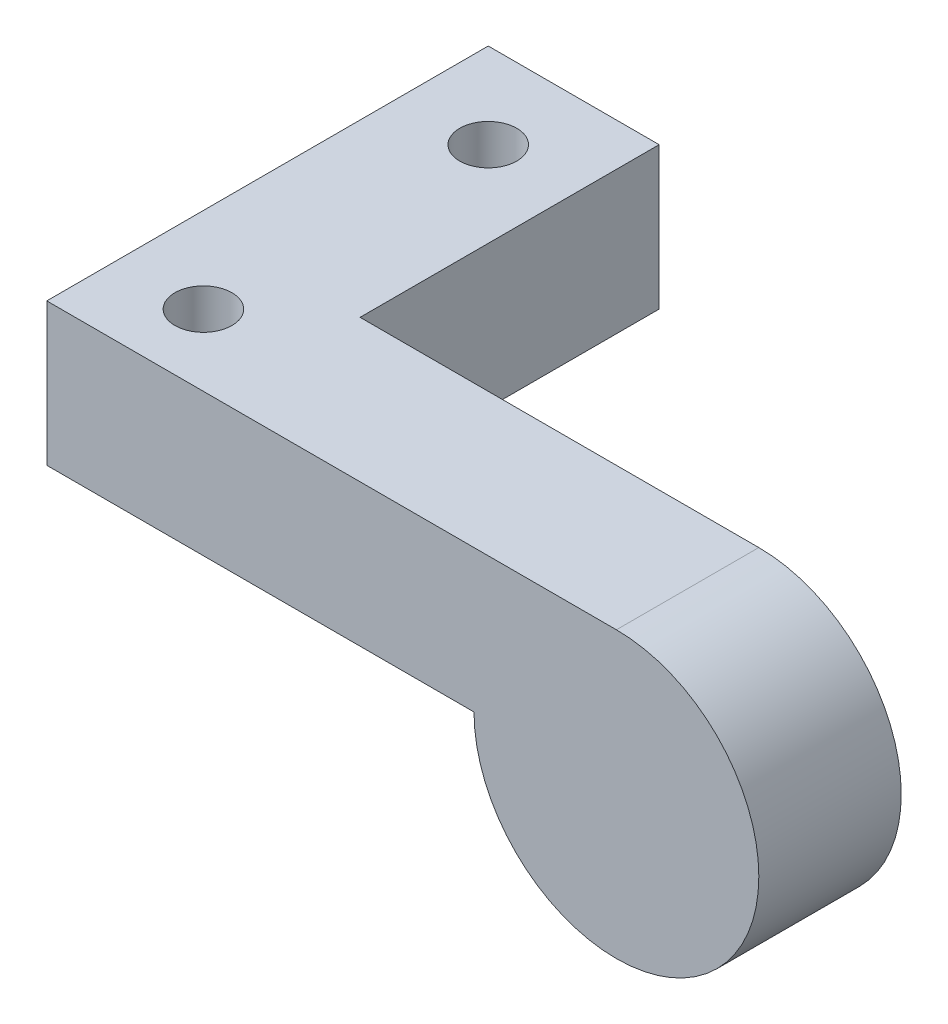
ISO-10303-21;
HEADER;
FILE_DESCRIPTION(('STEP AP214'),'2;1');
FILE_NAME('part.step','',(''),(''),'','','');
FILE_SCHEMA(('AUTOMOTIVE_DESIGN { 1 0 10303 214 1 1 1 1 }'));
ENDSEC;
DATA;
#1=APPLICATION_CONTEXT('core data for automotive mechanical design processes');
#2=APPLICATION_PROTOCOL_DEFINITION('international standard','automotive_design',2000,#1);
#3=PRODUCT_CONTEXT('',#1,'mechanical');
#4=PRODUCT('Part','Part','',(#3));
#5=PRODUCT_RELATED_PRODUCT_CATEGORY('part','',(#4));
#6=PRODUCT_DEFINITION_FORMATION('','',#4);
#7=PRODUCT_DEFINITION_CONTEXT('part definition',#1,'design');
#8=PRODUCT_DEFINITION('design','',#6,#7);
#9=PRODUCT_DEFINITION_SHAPE('','',#8);
#10=(LENGTH_UNIT() NAMED_UNIT(*) SI_UNIT(.MILLI.,.METRE.));
#11=(NAMED_UNIT(*) PLANE_ANGLE_UNIT() SI_UNIT($,.RADIAN.));
#12=(NAMED_UNIT(*) SI_UNIT($,.STERADIAN.) SOLID_ANGLE_UNIT());
#13=UNCERTAINTY_MEASURE_WITH_UNIT(LENGTH_MEASURE(1.E-05),#10,'distance_accuracy_value','');
#14=(GEOMETRIC_REPRESENTATION_CONTEXT(3) GLOBAL_UNCERTAINTY_ASSIGNED_CONTEXT((#13)) GLOBAL_UNIT_ASSIGNED_CONTEXT((#10,
#11,#12)) REPRESENTATION_CONTEXT('',''));
#15=CARTESIAN_POINT('',(0.,0.,0.));
#16=DIRECTION('',(0.,0.,1.));
#17=DIRECTION('',(1.,0.,0.));
#18=AXIS2_PLACEMENT_3D('',#15,#16,#17);
#19=CARTESIAN_POINT('',(0.,0.,0.));
#20=DIRECTION('',(0.,0.,1.));
#21=DIRECTION('',(1.,0.,0.));
#22=AXIS2_PLACEMENT_3D('',#19,#20,#21);
#23=PLANE('',#22);
#24=CARTESIAN_POINT('',(0.,0.,0.));
#25=DIRECTION('',(0.,0.,1.));
#26=DIRECTION('',(1.,0.,0.));
#27=AXIS2_PLACEMENT_3D('',#24,#25,#26);
#28=CIRCLE('',#27,2.5);
#29=CARTESIAN_POINT('',(2.5,0.,0.));
#30=VERTEX_POINT('',#29);
#31=EDGE_CURVE('E50',#30,#30,#28,.T.);
#32=ORIENTED_EDGE('',*,*,#31,.T.);
#33=EDGE_LOOP('',(#32));
#34=FACE_BOUND('',#33,.T.);
#35=CARTESIAN_POINT('',(0.,0.,0.));
#36=DIRECTION('',(0.,0.,1.));
#37=DIRECTION('',(1.,0.,0.));
#38=AXIS2_PLACEMENT_3D('',#35,#36,#37);
#39=CIRCLE('',#38,5.);
#40=CARTESIAN_POINT('',(-5.,0.,0.));
#41=VERTEX_POINT('',#40);
#42=CARTESIAN_POINT('',(0.,5.,0.));
#43=VERTEX_POINT('',#42);
#44=EDGE_CURVE('E11',#41,#43,#39,.T.);
#45=ORIENTED_EDGE('',*,*,#44,.F.);
#46=DIRECTION('',(-1.,0.,0.));
#47=VECTOR('',#46,1.);
#48=CARTESIAN_POINT('',(0.,0.,0.));
#49=LINE('',#48,#47);
#50=CARTESIAN_POINT('',(-14.,0.,0.));
#51=VERTEX_POINT('',#50);
#52=EDGE_CURVE('E257',#41,#51,#49,.T.);
#53=ORIENTED_EDGE('',*,*,#52,.T.);
#54=DIRECTION('',(0.,-1.,0.));
#55=VECTOR('',#54,1.);
#56=CARTESIAN_POINT('',(-14.,5.,0.));
#57=LINE('',#56,#55);
#58=CARTESIAN_POINT('',(-14.,5.,0.));
#59=VERTEX_POINT('',#58);
#60=EDGE_CURVE('E65',#59,#51,#57,.T.);
#61=ORIENTED_EDGE('',*,*,#60,.F.);
#62=DIRECTION('',(1.,0.,0.));
#63=VECTOR('',#62,1.);
#64=CARTESIAN_POINT('',(0.,5.,0.));
#65=LINE('',#64,#63);
#66=EDGE_CURVE('E117',#59,#43,#65,.T.);
#67=ORIENTED_EDGE('',*,*,#66,.T.);
#68=EDGE_LOOP('',(#45,#53,#61,#67));
#69=FACE_BOUND('',#68,.T.);
#70=ADVANCED_FACE('F41',(#34,#69),#23,.F.);
#71=CARTESIAN_POINT('',(0.,0.,3.));
#72=DIRECTION('',(0.,0.,-1.));
#73=DIRECTION('',(-1.,0.,0.));
#74=AXIS2_PLACEMENT_3D('',#71,#72,#73);
#75=CYLINDRICAL_SURFACE('',#74,5.);
#76=DIRECTION('',(0.,0.,-1.));
#77=VECTOR('',#76,1.);
#78=CARTESIAN_POINT('',(0.,5.,5.));
#79=LINE('',#78,#77);
#80=CARTESIAN_POINT('',(0.,5.,5.));
#81=VERTEX_POINT('',#80);
#82=EDGE_CURVE('E126',#81,#43,#79,.T.);
#83=ORIENTED_EDGE('',*,*,#82,.F.);
#84=CARTESIAN_POINT('',(0.,0.,5.));
#85=DIRECTION('',(0.,0.,1.));
#86=DIRECTION('',(1.,0.,0.));
#87=AXIS2_PLACEMENT_3D('',#84,#85,#86);
#88=CIRCLE('',#87,5.);
#89=CARTESIAN_POINT('',(-5.,0.,5.));
#90=VERTEX_POINT('',#89);
#91=EDGE_CURVE('E129',#90,#81,#88,.T.);
#92=ORIENTED_EDGE('',*,*,#91,.F.);
#93=DIRECTION('',(0.,0.,-1.));
#94=VECTOR('',#93,1.);
#95=CARTESIAN_POINT('',(-5.,0.,5.));
#96=LINE('',#95,#94);
#97=EDGE_CURVE('E100',#90,#41,#96,.T.);
#98=ORIENTED_EDGE('',*,*,#97,.T.);
#99=ORIENTED_EDGE('',*,*,#44,.T.);
#100=EDGE_LOOP('',(#83,#92,#98,#99));
#101=FACE_BOUND('',#100,.T.);
#102=ADVANCED_FACE('F43',(#101),#75,.T.);
#103=CARTESIAN_POINT('',(0.,0.,3.));
#104=DIRECTION('',(0.,0.,-1.));
#105=DIRECTION('',(-1.,0.,0.));
#106=AXIS2_PLACEMENT_3D('',#103,#104,#105);
#107=CYLINDRICAL_SURFACE('',#106,2.5);
#108=CARTESIAN_POINT('',(0.,0.,3.));
#109=DIRECTION('',(0.,0.,1.));
#110=DIRECTION('',(1.,0.,0.));
#111=AXIS2_PLACEMENT_3D('',#108,#109,#110);
#112=CIRCLE('',#111,2.5);
#113=CARTESIAN_POINT('',(2.5,0.,3.));
#114=VERTEX_POINT('',#113);
#115=EDGE_CURVE('E132',#114,#114,#112,.T.);
#116=ORIENTED_EDGE('',*,*,#115,.T.);
#117=EDGE_LOOP('',(#116));
#118=FACE_BOUND('',#117,.T.);
#119=ORIENTED_EDGE('',*,*,#31,.F.);
#120=EDGE_LOOP('',(#119));
#121=FACE_BOUND('',#120,.T.);
#122=ADVANCED_FACE('F139',(#118,#121),#107,.F.);
#123=CARTESIAN_POINT('',(0.,0.,3.));
#124=DIRECTION('',(0.,0.,1.));
#125=DIRECTION('',(1.,0.,0.));
#126=AXIS2_PLACEMENT_3D('',#123,#124,#125);
#127=PLANE('',#126);
#128=ORIENTED_EDGE('',*,*,#115,.F.);
#129=EDGE_LOOP('',(#128));
#130=FACE_BOUND('',#129,.T.);
#131=ADVANCED_FACE('F141',(#130),#127,.F.);
#132=CARTESIAN_POINT('',(0.,0.,5.));
#133=DIRECTION('',(0.,0.,1.));
#134=DIRECTION('',(1.,0.,0.));
#135=AXIS2_PLACEMENT_3D('',#132,#133,#134);
#136=PLANE('',#135);
#137=DIRECTION('',(1.,0.,0.));
#138=VECTOR('',#137,1.);
#139=CARTESIAN_POINT('',(-5.,0.,5.));
#140=LINE('',#139,#138);
#141=CARTESIAN_POINT('',(-20.,0.,5.));
#142=VERTEX_POINT('',#141);
#143=EDGE_CURVE('E95',#142,#90,#140,.T.);
#144=ORIENTED_EDGE('',*,*,#143,.T.);
#145=ORIENTED_EDGE('',*,*,#91,.T.);
#146=DIRECTION('',(1.,0.,0.));
#147=VECTOR('',#146,1.);
#148=CARTESIAN_POINT('',(0.,5.,5.));
#149=LINE('',#148,#147);
#150=CARTESIAN_POINT('',(-20.,5.,5.));
#151=VERTEX_POINT('',#150);
#152=EDGE_CURVE('E116',#151,#81,#149,.T.);
#153=ORIENTED_EDGE('',*,*,#152,.F.);
#154=DIRECTION('',(0.,1.,0.));
#155=VECTOR('',#154,1.);
#156=CARTESIAN_POINT('',(-20.,5.,5.));
#157=LINE('',#156,#155);
#158=EDGE_CURVE('E110',#142,#151,#157,.T.);
#159=ORIENTED_EDGE('',*,*,#158,.F.);
#160=EDGE_LOOP('',(#144,#145,#153,#159));
#161=FACE_BOUND('',#160,.T.);
#162=ADVANCED_FACE('F115',(#161),#136,.T.);
#163=CARTESIAN_POINT('',(0.,5.,5.));
#164=DIRECTION('',(0.,1.,0.));
#165=DIRECTION('',(0.,0.,1.));
#166=AXIS2_PLACEMENT_3D('',#163,#164,#165);
#167=PLANE('',#166);
#168=CARTESIAN_POINT('',(-17.,5.,-7.5));
#169=DIRECTION('',(0.,1.,0.));
#170=DIRECTION('',(0.,0.,1.));
#171=AXIS2_PLACEMENT_3D('',#168,#169,#170);
#172=CIRCLE('',#171,1.);
#173=CARTESIAN_POINT('',(-17.,5.,-6.5));
#174=VERTEX_POINT('',#173);
#175=EDGE_CURVE('E234',#174,#174,#172,.T.);
#176=ORIENTED_EDGE('',*,*,#175,.F.);
#177=EDGE_LOOP('',(#176));
#178=FACE_BOUND('',#177,.T.);
#179=CARTESIAN_POINT('',(-17.,5.,2.5));
#180=DIRECTION('',(0.,1.,0.));
#181=DIRECTION('',(0.,0.,1.));
#182=AXIS2_PLACEMENT_3D('',#179,#180,#181);
#183=CIRCLE('',#182,1.);
#184=CARTESIAN_POINT('',(-17.,5.,3.5));
#185=VERTEX_POINT('',#184);
#186=EDGE_CURVE('E121',#185,#185,#183,.T.);
#187=ORIENTED_EDGE('',*,*,#186,.F.);
#188=EDGE_LOOP('',(#187));
#189=FACE_BOUND('',#188,.T.);
#190=ORIENTED_EDGE('',*,*,#66,.F.);
#191=DIRECTION('',(0.,0.,1.));
#192=VECTOR('',#191,1.);
#193=CARTESIAN_POINT('',(-14.,5.,-10.5));
#194=LINE('',#193,#192);
#195=CARTESIAN_POINT('',(-14.,5.,-10.5));
#196=VERTEX_POINT('',#195);
#197=EDGE_CURVE('E241',#196,#59,#194,.T.);
#198=ORIENTED_EDGE('',*,*,#197,.F.);
#199=DIRECTION('',(1.,0.,0.));
#200=VECTOR('',#199,1.);
#201=CARTESIAN_POINT('',(-20.,5.,-10.5));
#202=LINE('',#201,#200);
#203=CARTESIAN_POINT('',(-20.,5.,-10.5));
#204=VERTEX_POINT('',#203);
#205=EDGE_CURVE('E247',#204,#196,#202,.T.);
#206=ORIENTED_EDGE('',*,*,#205,.F.);
#207=DIRECTION('',(0.,0.,-1.));
#208=VECTOR('',#207,1.);
#209=CARTESIAN_POINT('',(-20.,5.,5.));
#210=LINE('',#209,#208);
#211=EDGE_CURVE('E119',#151,#204,#210,.T.);
#212=ORIENTED_EDGE('',*,*,#211,.F.);
#213=ORIENTED_EDGE('',*,*,#152,.T.);
#214=ORIENTED_EDGE('',*,*,#82,.T.);
#215=EDGE_LOOP('',(#190,#198,#206,#212,#213,#214));
#216=FACE_BOUND('',#215,.T.);
#217=ADVANCED_FACE('F159',(#178,#189,#216),#167,.T.);
#218=CARTESIAN_POINT('',(-20.,5.,5.));
#219=DIRECTION('',(-1.,0.,0.));
#220=DIRECTION('',(0.,-1.,0.));
#221=AXIS2_PLACEMENT_3D('',#218,#219,#220);
#222=PLANE('',#221);
#223=DIRECTION('',(0.,0.,-1.));
#224=VECTOR('',#223,1.);
#225=CARTESIAN_POINT('',(-20.,0.,5.));
#226=LINE('',#225,#224);
#227=CARTESIAN_POINT('',(-20.,0.,-10.5));
#228=VERTEX_POINT('',#227);
#229=EDGE_CURVE('E57',#142,#228,#226,.T.);
#230=ORIENTED_EDGE('',*,*,#229,.F.);
#231=ORIENTED_EDGE('',*,*,#158,.T.);
#232=ORIENTED_EDGE('',*,*,#211,.T.);
#233=DIRECTION('',(0.,1.,0.));
#234=VECTOR('',#233,1.);
#235=CARTESIAN_POINT('',(-20.,5.,-10.5));
#236=LINE('',#235,#234);
#237=EDGE_CURVE('E112',#228,#204,#236,.T.);
#238=ORIENTED_EDGE('',*,*,#237,.F.);
#239=EDGE_LOOP('',(#230,#231,#232,#238));
#240=FACE_BOUND('',#239,.T.);
#241=ADVANCED_FACE('F108',(#240),#222,.T.);
#242=CARTESIAN_POINT('',(-17.,-5.,2.5));
#243=DIRECTION('',(0.,1.,0.));
#244=DIRECTION('',(0.,0.,1.));
#245=AXIS2_PLACEMENT_3D('',#242,#243,#244);
#246=CYLINDRICAL_SURFACE('',#245,1.);
#247=CARTESIAN_POINT('',(-17.,0.,2.5));
#248=DIRECTION('',(0.,1.,0.));
#249=DIRECTION('',(-1.,0.,0.));
#250=AXIS2_PLACEMENT_3D('',#247,#248,#249);
#251=CIRCLE('',#250,1.);
#252=CARTESIAN_POINT('',(-18.,0.,2.5));
#253=VERTEX_POINT('',#252);
#254=EDGE_CURVE('E254',#253,#253,#251,.F.);
#255=ORIENTED_EDGE('',*,*,#254,.T.);
#256=EDGE_LOOP('',(#255));
#257=FACE_BOUND('',#256,.T.);
#258=ORIENTED_EDGE('',*,*,#186,.T.);
#259=EDGE_LOOP('',(#258));
#260=FACE_BOUND('',#259,.T.);
#261=ADVANCED_FACE('F182',(#257,#260),#246,.F.);
#262=CARTESIAN_POINT('',(-14.,5.,-10.5));
#263=DIRECTION('',(-1.,0.,0.));
#264=DIRECTION('',(0.,-1.,0.));
#265=AXIS2_PLACEMENT_3D('',#262,#263,#264);
#266=PLANE('',#265);
#267=ORIENTED_EDGE('',*,*,#60,.T.);
#268=DIRECTION('',(0.,0.,-1.));
#269=VECTOR('',#268,1.);
#270=CARTESIAN_POINT('',(-14.,0.,-10.5));
#271=LINE('',#270,#269);
#272=CARTESIAN_POINT('',(-14.,0.,-10.5));
#273=VERTEX_POINT('',#272);
#274=EDGE_CURVE('E259',#51,#273,#271,.T.);
#275=ORIENTED_EDGE('',*,*,#274,.T.);
#276=DIRECTION('',(0.,-1.,0.));
#277=VECTOR('',#276,1.);
#278=CARTESIAN_POINT('',(-14.,5.,-10.5));
#279=LINE('',#278,#277);
#280=EDGE_CURVE('E246',#196,#273,#279,.T.);
#281=ORIENTED_EDGE('',*,*,#280,.F.);
#282=ORIENTED_EDGE('',*,*,#197,.T.);
#283=EDGE_LOOP('',(#267,#275,#281,#282));
#284=FACE_BOUND('',#283,.T.);
#285=ADVANCED_FACE('F191',(#284),#266,.F.);
#286=CARTESIAN_POINT('',(0.,0.,-10.5));
#287=DIRECTION('',(0.,0.,1.));
#288=DIRECTION('',(1.,0.,0.));
#289=AXIS2_PLACEMENT_3D('',#286,#287,#288);
#290=PLANE('',#289);
#291=ORIENTED_EDGE('',*,*,#280,.T.);
#292=DIRECTION('',(1.,0.,0.));
#293=VECTOR('',#292,1.);
#294=CARTESIAN_POINT('',(-5.,0.,-10.5));
#295=LINE('',#294,#293);
#296=EDGE_CURVE('E104',#228,#273,#295,.T.);
#297=ORIENTED_EDGE('',*,*,#296,.F.);
#298=ORIENTED_EDGE('',*,*,#237,.T.);
#299=ORIENTED_EDGE('',*,*,#205,.T.);
#300=EDGE_LOOP('',(#291,#297,#298,#299));
#301=FACE_BOUND('',#300,.T.);
#302=ADVANCED_FACE('F199',(#301),#290,.F.);
#303=CARTESIAN_POINT('',(-17.,-7.,-7.5));
#304=DIRECTION('',(0.,1.,0.));
#305=DIRECTION('',(0.,0.,1.));
#306=AXIS2_PLACEMENT_3D('',#303,#304,#305);
#307=CYLINDRICAL_SURFACE('',#306,1.);
#308=CARTESIAN_POINT('',(-17.,0.,-7.5));
#309=DIRECTION('',(0.,1.,0.));
#310=DIRECTION('',(-1.,0.,0.));
#311=AXIS2_PLACEMENT_3D('',#308,#309,#310);
#312=CIRCLE('',#311,1.);
#313=CARTESIAN_POINT('',(-18.,0.,-7.5));
#314=VERTEX_POINT('',#313);
#315=EDGE_CURVE('E45',#314,#314,#312,.F.);
#316=ORIENTED_EDGE('',*,*,#315,.T.);
#317=EDGE_LOOP('',(#316));
#318=FACE_BOUND('',#317,.T.);
#319=ORIENTED_EDGE('',*,*,#175,.T.);
#320=EDGE_LOOP('',(#319));
#321=FACE_BOUND('',#320,.T.);
#322=ADVANCED_FACE('F207',(#318,#321),#307,.F.);
#323=CARTESIAN_POINT('',(-5.,0.,5.));
#324=DIRECTION('',(0.,1.,0.));
#325=DIRECTION('',(-1.,0.,0.));
#326=AXIS2_PLACEMENT_3D('',#323,#324,#325);
#327=PLANE('',#326);
#328=ORIENTED_EDGE('',*,*,#97,.F.);
#329=ORIENTED_EDGE('',*,*,#143,.F.);
#330=ORIENTED_EDGE('',*,*,#229,.T.);
#331=ORIENTED_EDGE('',*,*,#296,.T.);
#332=ORIENTED_EDGE('',*,*,#274,.F.);
#333=ORIENTED_EDGE('',*,*,#52,.F.);
#334=EDGE_LOOP('',(#328,#329,#330,#331,#332,#333));
#335=FACE_BOUND('',#334,.T.);
#336=ORIENTED_EDGE('',*,*,#315,.F.);
#337=EDGE_LOOP('',(#336));
#338=FACE_BOUND('',#337,.T.);
#339=ORIENTED_EDGE('',*,*,#254,.F.);
#340=EDGE_LOOP('',(#339));
#341=FACE_BOUND('',#340,.T.);
#342=ADVANCED_FACE('F96',(#335,#338,#341),#327,.F.);
#343=CLOSED_SHELL('',(#70,#102,#122,#131,#162,#217,#241,#261,#285,#302,#322,#342));
#344=MANIFOLD_SOLID_BREP('B2',#343);
#345=ADVANCED_BREP_SHAPE_REPRESENTATION('',(#18,#344),#14);
#346=SHAPE_DEFINITION_REPRESENTATION(#9,#345);
ENDSEC;
END-ISO-10303-21;
